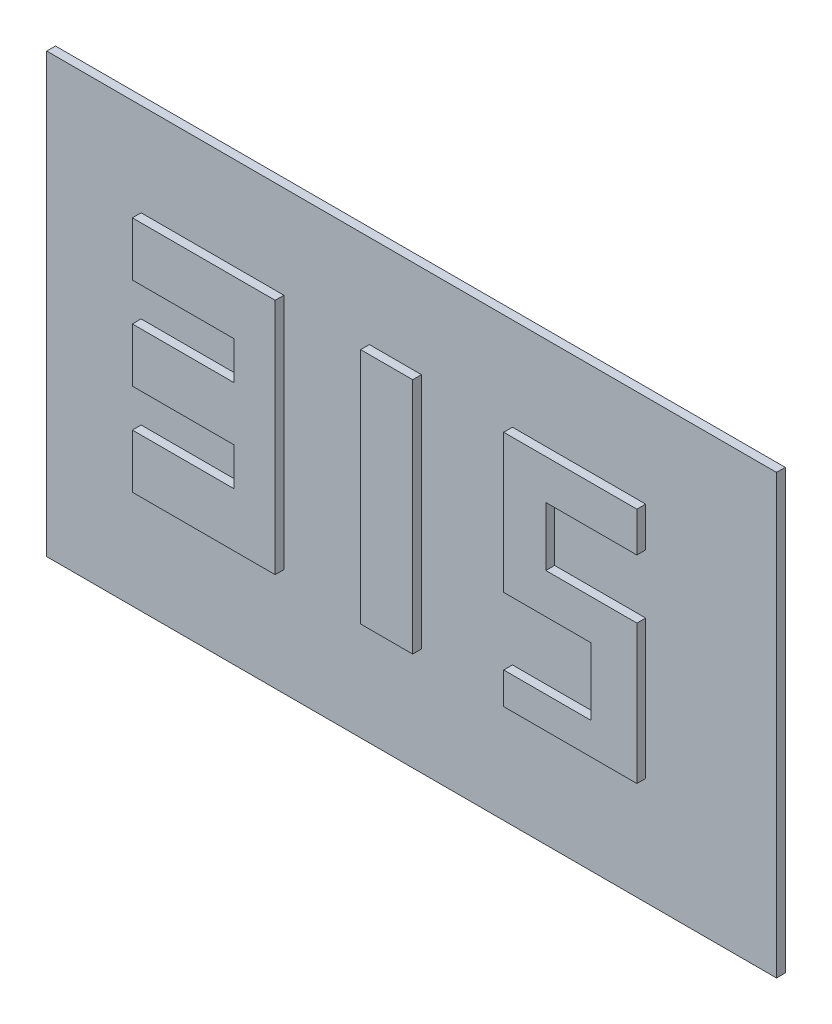
ISO-10303-21;
HEADER;
FILE_DESCRIPTION(('STEP AP214'),'2;1');
FILE_NAME('part.step','',(''),(''),'','','');
FILE_SCHEMA(('AUTOMOTIVE_DESIGN { 1 0 10303 214 1 1 1 1 }'));
ENDSEC;
DATA;
#1=APPLICATION_CONTEXT('core data for automotive mechanical design processes');
#2=APPLICATION_PROTOCOL_DEFINITION('international standard','automotive_design',2000,#1);
#3=PRODUCT_CONTEXT('',#1,'mechanical');
#4=PRODUCT('Part','Part','',(#3));
#5=PRODUCT_RELATED_PRODUCT_CATEGORY('part','',(#4));
#6=PRODUCT_DEFINITION_FORMATION('','',#4);
#7=PRODUCT_DEFINITION_CONTEXT('part definition',#1,'design');
#8=PRODUCT_DEFINITION('design','',#6,#7);
#9=PRODUCT_DEFINITION_SHAPE('','',#8);
#10=(LENGTH_UNIT() NAMED_UNIT(*) SI_UNIT(.MILLI.,.METRE.));
#11=(NAMED_UNIT(*) PLANE_ANGLE_UNIT() SI_UNIT($,.RADIAN.));
#12=(NAMED_UNIT(*) SI_UNIT($,.STERADIAN.) SOLID_ANGLE_UNIT());
#13=UNCERTAINTY_MEASURE_WITH_UNIT(LENGTH_MEASURE(1.E-05),#10,'distance_accuracy_value','');
#14=(GEOMETRIC_REPRESENTATION_CONTEXT(3) GLOBAL_UNCERTAINTY_ASSIGNED_CONTEXT((#13)) GLOBAL_UNIT_ASSIGNED_CONTEXT((#10,
#11,#12)) REPRESENTATION_CONTEXT('',''));
#15=CARTESIAN_POINT('',(0.,0.,0.));
#16=DIRECTION('',(0.,0.,1.));
#17=DIRECTION('',(1.,0.,0.));
#18=AXIS2_PLACEMENT_3D('',#15,#16,#17);
#19=CARTESIAN_POINT('',(-66.3624700861632,-39.7036138012313,3.));
#20=DIRECTION('',(0.,0.,1.));
#21=DIRECTION('',(1.,0.,0.));
#22=AXIS2_PLACEMENT_3D('',#19,#20,#21);
#23=PLANE('',#22);
#24=DIRECTION('',(1.,0.,0.));
#25=VECTOR('',#24,1.);
#26=CARTESIAN_POINT('',(-66.3624700861632,110.306362673787,3.));
#27=LINE('',#26,#25);
#28=CARTESIAN_POINT('',(-66.3624700861632,110.306362673787,3.));
#29=VERTEX_POINT('',#28);
#30=CARTESIAN_POINT('',(183.648168456552,110.306362673787,3.));
#31=VERTEX_POINT('',#30);
#32=EDGE_CURVE('E289',#29,#31,#27,.T.);
#33=ORIENTED_EDGE('',*,*,#32,.F.);
#34=DIRECTION('',(0.,1.,0.));
#35=VECTOR('',#34,1.);
#36=CARTESIAN_POINT('',(-66.3624700861632,-39.7036138012313,3.));
#37=LINE('',#36,#35);
#38=CARTESIAN_POINT('',(-66.3624700861632,-39.7036138012313,3.));
#39=VERTEX_POINT('',#38);
#40=EDGE_CURVE('E271',#39,#29,#37,.T.);
#41=ORIENTED_EDGE('',*,*,#40,.F.);
#42=DIRECTION('',(1.,0.,0.));
#43=VECTOR('',#42,1.);
#44=CARTESIAN_POINT('',(-66.3624700861632,-39.7036138012313,3.));
#45=LINE('',#44,#43);
#46=CARTESIAN_POINT('',(183.648168456552,-39.7036138012313,3.));
#47=VERTEX_POINT('',#46);
#48=EDGE_CURVE('E263',#39,#47,#45,.T.);
#49=ORIENTED_EDGE('',*,*,#48,.T.);
#50=DIRECTION('',(0.,1.,0.));
#51=VECTOR('',#50,1.);
#52=CARTESIAN_POINT('',(183.648168456552,-39.7036138012313,3.));
#53=LINE('',#52,#51);
#54=EDGE_CURVE('E268',#47,#31,#53,.T.);
#55=ORIENTED_EDGE('',*,*,#54,.T.);
#56=EDGE_LOOP('',(#33,#41,#49,#55));
#57=FACE_BOUND('',#56,.T.);
#58=DIRECTION('',(1.,0.,0.));
#59=VECTOR('',#58,1.);
#60=CARTESIAN_POINT('',(93.1901538605668,30.975039233359,3.));
#61=LINE('',#60,#59);
#62=CARTESIAN_POINT('',(93.1901538605668,30.975039233359,3.));
#63=VERTEX_POINT('',#62);
#64=CARTESIAN_POINT('',(123.044447567463,30.975039233359,3.));
#65=VERTEX_POINT('',#64);
#66=EDGE_CURVE('E296',#63,#65,#61,.T.);
#67=ORIENTED_EDGE('',*,*,#66,.F.);
#68=DIRECTION('',(0.,-1.,0.));
#69=VECTOR('',#68,1.);
#70=CARTESIAN_POINT('',(93.1901538605668,30.975039233359,3.));
#71=LINE('',#70,#69);
#72=CARTESIAN_POINT('',(93.1901538605668,78.4878188977571,3.));
#73=VERTEX_POINT('',#72);
#74=EDGE_CURVE('E299',#73,#63,#71,.T.);
#75=ORIENTED_EDGE('',*,*,#74,.F.);
#76=DIRECTION('',(-1.,0.,0.));
#77=VECTOR('',#76,1.);
#78=CARTESIAN_POINT('',(93.1901538605668,78.4878188977571,3.));
#79=LINE('',#78,#77);
#80=CARTESIAN_POINT('',(138.816527261673,78.4878188977571,3.));
#81=VERTEX_POINT('',#80);
#82=EDGE_CURVE('E305',#81,#73,#79,.T.);
#83=ORIENTED_EDGE('',*,*,#82,.F.);
#84=DIRECTION('',(0.,1.,0.));
#85=VECTOR('',#84,1.);
#86=CARTESIAN_POINT('',(138.816527261673,78.4878188977571,3.));
#87=LINE('',#86,#85);
#88=CARTESIAN_POINT('',(138.816527261673,64.8843945298662,3.));
#89=VERTEX_POINT('',#88);
#90=EDGE_CURVE('E308',#89,#81,#87,.T.);
#91=ORIENTED_EDGE('',*,*,#90,.F.);
#92=DIRECTION('',(1.,0.,0.));
#93=VECTOR('',#92,1.);
#94=CARTESIAN_POINT('',(107.631986914306,64.8843945298662,3.));
#95=LINE('',#94,#93);
#96=CARTESIAN_POINT('',(107.631986914306,64.8843945298662,3.));
#97=VERTEX_POINT('',#96);
#98=EDGE_CURVE('E313',#97,#89,#95,.T.);
#99=ORIENTED_EDGE('',*,*,#98,.F.);
#100=DIRECTION('',(0.,1.,0.));
#101=VECTOR('',#100,1.);
#102=CARTESIAN_POINT('',(107.631986914306,64.8843945298662,3.));
#103=LINE('',#102,#101);
#104=CARTESIAN_POINT('',(107.631986914306,44.6883814488582,3.));
#105=VERTEX_POINT('',#104);
#106=EDGE_CURVE('E316',#105,#97,#103,.T.);
#107=ORIENTED_EDGE('',*,*,#106,.F.);
#108=DIRECTION('',(-1.,0.,0.));
#109=VECTOR('',#108,1.);
#110=CARTESIAN_POINT('',(107.631986914306,44.6883814488582,3.));
#111=LINE('',#110,#109);
#112=CARTESIAN_POINT('',(138.816527261673,44.6883814488582,3.));
#113=VERTEX_POINT('',#112);
#114=EDGE_CURVE('E319',#113,#105,#111,.T.);
#115=ORIENTED_EDGE('',*,*,#114,.F.);
#116=DIRECTION('',(0.,1.,0.));
#117=VECTOR('',#116,1.);
#118=CARTESIAN_POINT('',(138.816527261673,44.6883814488582,3.));
#119=LINE('',#118,#117);
#120=CARTESIAN_POINT('',(138.816527261673,-2.91899550319413,3.));
#121=VERTEX_POINT('',#120);
#122=EDGE_CURVE('E322',#121,#113,#119,.T.);
#123=ORIENTED_EDGE('',*,*,#122,.F.);
#124=DIRECTION('',(1.,0.,0.));
#125=VECTOR('',#124,1.);
#126=CARTESIAN_POINT('',(93.1901538605668,-2.91899550319413,3.));
#127=LINE('',#126,#125);
#128=CARTESIAN_POINT('',(93.1901538605668,-2.91899550319413,3.));
#129=VERTEX_POINT('',#128);
#130=EDGE_CURVE('E325',#129,#121,#127,.T.);
#131=ORIENTED_EDGE('',*,*,#130,.F.);
#132=DIRECTION('',(0.,-1.,0.));
#133=VECTOR('',#132,1.);
#134=CARTESIAN_POINT('',(93.1901538605668,-2.91899550319413,3.));
#135=LINE('',#134,#133);
#136=CARTESIAN_POINT('',(93.1901538605668,7.95734499633109,3.));
#137=VERTEX_POINT('',#136);
#138=EDGE_CURVE('E328',#137,#129,#135,.T.);
#139=ORIENTED_EDGE('',*,*,#138,.F.);
#140=DIRECTION('',(-1.,0.,0.));
#141=VECTOR('',#140,1.);
#142=CARTESIAN_POINT('',(123.044447567463,7.95734499633109,3.));
#143=LINE('',#142,#141);
#144=CARTESIAN_POINT('',(123.044447567463,7.95734499633109,3.));
#145=VERTEX_POINT('',#144);
#146=EDGE_CURVE('E331',#145,#137,#143,.T.);
#147=ORIENTED_EDGE('',*,*,#146,.F.);
#148=DIRECTION('',(0.,-1.,0.));
#149=VECTOR('',#148,1.);
#150=CARTESIAN_POINT('',(123.044447567463,30.975039233359,3.));
#151=LINE('',#150,#149);
#152=EDGE_CURVE('E300',#65,#145,#151,.T.);
#153=ORIENTED_EDGE('',*,*,#152,.F.);
#154=EDGE_LOOP('',(#67,#75,#83,#91,#99,#107,#115,#123,#131,#139,#147,#153));
#155=FACE_BOUND('',#154,.T.);
#156=DIRECTION('',(1.,0.,0.));
#157=VECTOR('',#156,1.);
#158=CARTESIAN_POINT('',(44.1696736487118,-2.91899550319413,3.));
#159=LINE('',#158,#157);
#160=CARTESIAN_POINT('',(44.1696736487118,-2.91899550319413,3.));
#161=VERTEX_POINT('',#160);
#162=CARTESIAN_POINT('',(62.0071447314487,-2.91899550319413,3.));
#163=VERTEX_POINT('',#162);
#164=EDGE_CURVE('E336',#161,#163,#159,.T.);
#165=ORIENTED_EDGE('',*,*,#164,.F.);
#166=DIRECTION('',(0.,-1.,0.));
#167=VECTOR('',#166,1.);
#168=CARTESIAN_POINT('',(44.1696736487118,78.4878188977571,3.));
#169=LINE('',#168,#167);
#170=CARTESIAN_POINT('',(44.1696736487118,78.4878188977571,3.));
#171=VERTEX_POINT('',#170);
#172=EDGE_CURVE('E339',#171,#161,#169,.T.);
#173=ORIENTED_EDGE('',*,*,#172,.F.);
#174=DIRECTION('',(-1.,0.,0.));
#175=VECTOR('',#174,1.);
#176=CARTESIAN_POINT('',(44.1696736487118,78.4878188977571,3.));
#177=LINE('',#176,#175);
#178=CARTESIAN_POINT('',(62.0071447314487,78.4878188977571,3.));
#179=VERTEX_POINT('',#178);
#180=EDGE_CURVE('E345',#179,#171,#177,.T.);
#181=ORIENTED_EDGE('',*,*,#180,.F.);
#182=DIRECTION('',(0.,1.,0.));
#183=VECTOR('',#182,1.);
#184=CARTESIAN_POINT('',(62.0071447314487,78.4878188977571,3.));
#185=LINE('',#184,#183);
#186=EDGE_CURVE('E340',#163,#179,#185,.T.);
#187=ORIENTED_EDGE('',*,*,#186,.F.);
#188=EDGE_LOOP('',(#165,#173,#181,#187));
#189=FACE_BOUND('',#188,.T.);
#190=DIRECTION('',(1.,0.,0.));
#191=VECTOR('',#190,1.);
#192=CARTESIAN_POINT('',(-34.0341186940484,60.0379505387289,3.));
#193=LINE('',#192,#191);
#194=CARTESIAN_POINT('',(-34.0341186940484,60.0379505387289,3.));
#195=VERTEX_POINT('',#194);
#196=CARTESIAN_POINT('',(0.744298141440614,60.0379505387289,3.));
#197=VERTEX_POINT('',#196);
#198=EDGE_CURVE('E352',#195,#197,#193,.T.);
#199=ORIENTED_EDGE('',*,*,#198,.F.);
#200=DIRECTION('',(0.,-1.,0.));
#201=VECTOR('',#200,1.);
#202=CARTESIAN_POINT('',(-34.0341186940484,78.4878188977571,3.));
#203=LINE('',#202,#201);
#204=CARTESIAN_POINT('',(-34.0341186940484,78.4878188977571,3.));
#205=VERTEX_POINT('',#204);
#206=EDGE_CURVE('E344',#205,#195,#203,.T.);
#207=ORIENTED_EDGE('',*,*,#206,.F.);
#208=DIRECTION('',(-1.,0.,0.));
#209=VECTOR('',#208,1.);
#210=CARTESIAN_POINT('',(-34.0341186940484,78.4878188977571,3.));
#211=LINE('',#210,#209);
#212=CARTESIAN_POINT('',(14.8859034973977,78.4878188977571,3.));
#213=VERTEX_POINT('',#212);
#214=EDGE_CURVE('E359',#213,#205,#211,.T.);
#215=ORIENTED_EDGE('',*,*,#214,.F.);
#216=DIRECTION('',(0.,1.,0.));
#217=VECTOR('',#216,1.);
#218=CARTESIAN_POINT('',(14.8859034973977,78.4878188977571,3.));
#219=LINE('',#218,#217);
#220=CARTESIAN_POINT('',(14.8859034973977,-2.91899550319413,3.));
#221=VERTEX_POINT('',#220);
#222=EDGE_CURVE('E363',#221,#213,#219,.T.);
#223=ORIENTED_EDGE('',*,*,#222,.F.);
#224=DIRECTION('',(1.,0.,0.));
#225=VECTOR('',#224,1.);
#226=CARTESIAN_POINT('',(-34.0341186940484,-2.91899550319413,3.));
#227=LINE('',#226,#225);
#228=CARTESIAN_POINT('',(-34.0341186940484,-2.91899550319413,3.));
#229=VERTEX_POINT('',#228);
#230=EDGE_CURVE('E366',#229,#221,#227,.T.);
#231=ORIENTED_EDGE('',*,*,#230,.F.);
#232=DIRECTION('',(0.,-1.,0.));
#233=VECTOR('',#232,1.);
#234=CARTESIAN_POINT('',(-34.0341186940484,-2.91899550319413,3.));
#235=LINE('',#234,#233);
#236=CARTESIAN_POINT('',(-34.0341186940484,15.530872855834,3.));
#237=VERTEX_POINT('',#236);
#238=EDGE_CURVE('E369',#237,#229,#235,.T.);
#239=ORIENTED_EDGE('',*,*,#238,.F.);
#240=DIRECTION('',(-1.,0.,0.));
#241=VECTOR('',#240,1.);
#242=CARTESIAN_POINT('',(0.744298141440627,15.5308728558341,3.));
#243=LINE('',#242,#241);
#244=CARTESIAN_POINT('',(0.744298141440627,15.5308728558341,3.));
#245=VERTEX_POINT('',#244);
#246=EDGE_CURVE('E372',#245,#237,#243,.T.);
#247=ORIENTED_EDGE('',*,*,#246,.F.);
#248=DIRECTION('',(0.,-1.,0.));
#249=VECTOR('',#248,1.);
#250=CARTESIAN_POINT('',(0.744298141440627,28.5594775177674,3.));
#251=LINE('',#250,#249);
#252=CARTESIAN_POINT('',(0.744298141440627,28.5594775177674,3.));
#253=VERTEX_POINT('',#252);
#254=EDGE_CURVE('E375',#253,#245,#251,.T.);
#255=ORIENTED_EDGE('',*,*,#254,.F.);
#256=DIRECTION('',(1.,0.,0.));
#257=VECTOR('',#256,1.);
#258=CARTESIAN_POINT('',(0.744298141440627,28.5594775177674,3.));
#259=LINE('',#258,#257);
#260=CARTESIAN_POINT('',(-34.0341186940484,28.5594775177674,3.));
#261=VERTEX_POINT('',#260);
#262=EDGE_CURVE('E378',#261,#253,#259,.T.);
#263=ORIENTED_EDGE('',*,*,#262,.F.);
#264=DIRECTION('',(0.,-1.,0.));
#265=VECTOR('',#264,1.);
#266=CARTESIAN_POINT('',(-34.0341186940484,47.0093458767955,3.));
#267=LINE('',#266,#265);
#268=CARTESIAN_POINT('',(-34.0341186940484,47.0093458767955,3.));
#269=VERTEX_POINT('',#268);
#270=EDGE_CURVE('E381',#269,#261,#267,.T.);
#271=ORIENTED_EDGE('',*,*,#270,.F.);
#272=DIRECTION('',(-1.,0.,0.));
#273=VECTOR('',#272,1.);
#274=CARTESIAN_POINT('',(0.744298141440614,47.0093458767956,3.));
#275=LINE('',#274,#273);
#276=CARTESIAN_POINT('',(0.744298141440614,47.0093458767956,3.));
#277=VERTEX_POINT('',#276);
#278=EDGE_CURVE('E384',#277,#269,#275,.T.);
#279=ORIENTED_EDGE('',*,*,#278,.F.);
#280=DIRECTION('',(0.,-1.,0.));
#281=VECTOR('',#280,1.);
#282=CARTESIAN_POINT('',(0.744298141440614,60.0379505387289,3.));
#283=LINE('',#282,#281);
#284=EDGE_CURVE('E355',#197,#277,#283,.T.);
#285=ORIENTED_EDGE('',*,*,#284,.F.);
#286=EDGE_LOOP('',(#199,#207,#215,#223,#231,#239,#247,#255,#263,#271,#279,#285));
#287=FACE_BOUND('',#286,.T.);
#288=ADVANCED_FACE('F46',(#57,#155,#189,#287),#23,.T.);
#289=CARTESIAN_POINT('',(-66.3624700861632,110.306362673787,3.));
#290=DIRECTION('',(0.,1.,0.));
#291=DIRECTION('',(0.,0.,1.));
#292=AXIS2_PLACEMENT_3D('',#289,#290,#291);
#293=PLANE('',#292);
#294=DIRECTION('',(1.,0.,0.));
#295=VECTOR('',#294,1.);
#296=CARTESIAN_POINT('',(-66.3624700861632,110.306362673787,0.));
#297=LINE('',#296,#295);
#298=CARTESIAN_POINT('',(-66.3624700861632,110.306362673787,0.));
#299=VERTEX_POINT('',#298);
#300=CARTESIAN_POINT('',(183.648168456552,110.306362673787,0.));
#301=VERTEX_POINT('',#300);
#302=EDGE_CURVE('E389',#299,#301,#297,.T.);
#303=ORIENTED_EDGE('',*,*,#302,.F.);
#304=DIRECTION('',(0.,0.,-1.));
#305=VECTOR('',#304,1.);
#306=CARTESIAN_POINT('',(-66.3624700861632,110.306362673787,3.));
#307=LINE('',#306,#305);
#308=EDGE_CURVE('E12',#29,#299,#307,.T.);
#309=ORIENTED_EDGE('',*,*,#308,.F.);
#310=ORIENTED_EDGE('',*,*,#32,.T.);
#311=DIRECTION('',(0.,0.,-1.));
#312=VECTOR('',#311,1.);
#313=CARTESIAN_POINT('',(183.648168456552,110.306362673787,3.));
#314=LINE('',#313,#312);
#315=EDGE_CURVE('E284',#31,#301,#314,.T.);
#316=ORIENTED_EDGE('',*,*,#315,.T.);
#317=EDGE_LOOP('',(#303,#309,#310,#316));
#318=FACE_BOUND('',#317,.T.);
#319=ADVANCED_FACE('F639',(#318),#293,.T.);
#320=CARTESIAN_POINT('',(-66.3624700861632,-39.7036138012313,3.));
#321=DIRECTION('',(-1.,0.,0.));
#322=DIRECTION('',(0.,0.,1.));
#323=AXIS2_PLACEMENT_3D('',#320,#321,#322);
#324=PLANE('',#323);
#325=DIRECTION('',(0.,1.,0.));
#326=VECTOR('',#325,1.);
#327=CARTESIAN_POINT('',(-66.3624700861632,-39.7036138012313,0.));
#328=LINE('',#327,#326);
#329=CARTESIAN_POINT('',(-66.3624700861632,-39.7036138012313,0.));
#330=VERTEX_POINT('',#329);
#331=EDGE_CURVE('E292',#330,#299,#328,.T.);
#332=ORIENTED_EDGE('',*,*,#331,.F.);
#333=DIRECTION('',(0.,0.,-1.));
#334=VECTOR('',#333,1.);
#335=CARTESIAN_POINT('',(-66.3624700861632,-39.7036138012313,3.));
#336=LINE('',#335,#334);
#337=EDGE_CURVE('E57',#39,#330,#336,.T.);
#338=ORIENTED_EDGE('',*,*,#337,.F.);
#339=ORIENTED_EDGE('',*,*,#40,.T.);
#340=ORIENTED_EDGE('',*,*,#308,.T.);
#341=EDGE_LOOP('',(#332,#338,#339,#340));
#342=FACE_BOUND('',#341,.T.);
#343=ADVANCED_FACE('F644',(#342),#324,.T.);
#344=CARTESIAN_POINT('',(-66.3624700861632,-39.7036138012313,3.));
#345=DIRECTION('',(0.,1.,0.));
#346=DIRECTION('',(0.,0.,1.));
#347=AXIS2_PLACEMENT_3D('',#344,#345,#346);
#348=PLANE('',#347);
#349=DIRECTION('',(1.,0.,0.));
#350=VECTOR('',#349,1.);
#351=CARTESIAN_POINT('',(-66.3624700861632,-39.7036138012313,0.));
#352=LINE('',#351,#350);
#353=CARTESIAN_POINT('',(183.648168456552,-39.7036138012313,0.));
#354=VERTEX_POINT('',#353);
#355=EDGE_CURVE('E279',#330,#354,#352,.T.);
#356=ORIENTED_EDGE('',*,*,#355,.T.);
#357=DIRECTION('',(0.,0.,-1.));
#358=VECTOR('',#357,1.);
#359=CARTESIAN_POINT('',(183.648168456552,-39.7036138012313,3.));
#360=LINE('',#359,#358);
#361=EDGE_CURVE('E276',#47,#354,#360,.T.);
#362=ORIENTED_EDGE('',*,*,#361,.F.);
#363=ORIENTED_EDGE('',*,*,#48,.F.);
#364=ORIENTED_EDGE('',*,*,#337,.T.);
#365=EDGE_LOOP('',(#356,#362,#363,#364));
#366=FACE_BOUND('',#365,.T.);
#367=ADVANCED_FACE('F277',(#366),#348,.F.);
#368=CARTESIAN_POINT('',(183.648168456552,-39.7036138012313,3.));
#369=DIRECTION('',(-1.,0.,0.));
#370=DIRECTION('',(0.,0.,1.));
#371=AXIS2_PLACEMENT_3D('',#368,#369,#370);
#372=PLANE('',#371);
#373=DIRECTION('',(0.,1.,0.));
#374=VECTOR('',#373,1.);
#375=CARTESIAN_POINT('',(183.648168456552,-39.7036138012313,0.));
#376=LINE('',#375,#374);
#377=EDGE_CURVE('E392',#354,#301,#376,.T.);
#378=ORIENTED_EDGE('',*,*,#377,.T.);
#379=ORIENTED_EDGE('',*,*,#315,.F.);
#380=ORIENTED_EDGE('',*,*,#54,.F.);
#381=ORIENTED_EDGE('',*,*,#361,.T.);
#382=EDGE_LOOP('',(#378,#379,#380,#381));
#383=FACE_BOUND('',#382,.T.);
#384=ADVANCED_FACE('F286',(#383),#372,.F.);
#385=CARTESIAN_POINT('',(-66.3624700861632,-39.7036138012313,0.));
#386=DIRECTION('',(0.,0.,1.));
#387=DIRECTION('',(1.,0.,0.));
#388=AXIS2_PLACEMENT_3D('',#385,#386,#387);
#389=PLANE('',#388);
#390=ORIENTED_EDGE('',*,*,#302,.T.);
#391=ORIENTED_EDGE('',*,*,#377,.F.);
#392=ORIENTED_EDGE('',*,*,#355,.F.);
#393=ORIENTED_EDGE('',*,*,#331,.T.);
#394=EDGE_LOOP('',(#390,#391,#392,#393));
#395=FACE_BOUND('',#394,.T.);
#396=ADVANCED_FACE('F655',(#395),#389,.F.);
#397=CARTESIAN_POINT('',(93.1901538605668,30.975039233359,6.));
#398=DIRECTION('',(1.,0.,0.));
#399=DIRECTION('',(0.,0.,-1.));
#400=AXIS2_PLACEMENT_3D('',#397,#398,#399);
#401=PLANE('',#400);
#402=ORIENTED_EDGE('',*,*,#74,.T.);
#403=DIRECTION('',(0.,0.,-1.));
#404=VECTOR('',#403,1.);
#405=CARTESIAN_POINT('',(93.1901538605668,30.975039233359,6.));
#406=LINE('',#405,#404);
#407=CARTESIAN_POINT('',(93.1901538605668,30.975039233359,6.));
#408=VERTEX_POINT('',#407);
#409=EDGE_CURVE('E406',#408,#63,#406,.T.);
#410=ORIENTED_EDGE('',*,*,#409,.F.);
#411=DIRECTION('',(0.,-1.,0.));
#412=VECTOR('',#411,1.);
#413=CARTESIAN_POINT('',(93.1901538605668,30.975039233359,6.));
#414=LINE('',#413,#412);
#415=CARTESIAN_POINT('',(93.1901538605668,78.4878188977571,6.));
#416=VERTEX_POINT('',#415);
#417=EDGE_CURVE('E309',#416,#408,#414,.T.);
#418=ORIENTED_EDGE('',*,*,#417,.F.);
#419=DIRECTION('',(0.,0.,-1.));
#420=VECTOR('',#419,1.);
#421=CARTESIAN_POINT('',(93.1901538605668,78.4878188977571,6.));
#422=LINE('',#421,#420);
#423=EDGE_CURVE('E414',#416,#73,#422,.T.);
#424=ORIENTED_EDGE('',*,*,#423,.T.);
#425=EDGE_LOOP('',(#402,#410,#418,#424));
#426=FACE_BOUND('',#425,.T.);
#427=ADVANCED_FACE('F658',(#426),#401,.F.);
#428=CARTESIAN_POINT('',(93.1901538605668,30.975039233359,6.));
#429=DIRECTION('',(0.,1.,0.));
#430=DIRECTION('',(0.,0.,1.));
#431=AXIS2_PLACEMENT_3D('',#428,#429,#430);
#432=PLANE('',#431);
#433=ORIENTED_EDGE('',*,*,#66,.T.);
#434=DIRECTION('',(0.,0.,-1.));
#435=VECTOR('',#434,1.);
#436=CARTESIAN_POINT('',(123.044447567463,30.975039233359,6.));
#437=LINE('',#436,#435);
#438=CARTESIAN_POINT('',(123.044447567463,30.975039233359,6.));
#439=VERTEX_POINT('',#438);
#440=EDGE_CURVE('E409',#439,#65,#437,.T.);
#441=ORIENTED_EDGE('',*,*,#440,.F.);
#442=DIRECTION('',(1.,0.,0.));
#443=VECTOR('',#442,1.);
#444=CARTESIAN_POINT('',(93.1901538605668,30.975039233359,6.));
#445=LINE('',#444,#443);
#446=EDGE_CURVE('E413',#408,#439,#445,.T.);
#447=ORIENTED_EDGE('',*,*,#446,.F.);
#448=ORIENTED_EDGE('',*,*,#409,.T.);
#449=EDGE_LOOP('',(#433,#441,#447,#448));
#450=FACE_BOUND('',#449,.T.);
#451=ADVANCED_FACE('F662',(#450),#432,.F.);
#452=CARTESIAN_POINT('',(123.044447567463,30.975039233359,6.));
#453=DIRECTION('',(1.,0.,0.));
#454=DIRECTION('',(0.,0.,-1.));
#455=AXIS2_PLACEMENT_3D('',#452,#453,#454);
#456=PLANE('',#455);
#457=ORIENTED_EDGE('',*,*,#152,.T.);
#458=DIRECTION('',(0.,0.,-1.));
#459=VECTOR('',#458,1.);
#460=CARTESIAN_POINT('',(123.044447567463,7.95734499633109,6.));
#461=LINE('',#460,#459);
#462=CARTESIAN_POINT('',(123.044447567463,7.95734499633109,6.));
#463=VERTEX_POINT('',#462);
#464=EDGE_CURVE('E423',#463,#145,#461,.T.);
#465=ORIENTED_EDGE('',*,*,#464,.F.);
#466=DIRECTION('',(0.,-1.,0.));
#467=VECTOR('',#466,1.);
#468=CARTESIAN_POINT('',(123.044447567463,30.975039233359,6.));
#469=LINE('',#468,#467);
#470=EDGE_CURVE('E426',#439,#463,#469,.T.);
#471=ORIENTED_EDGE('',*,*,#470,.F.);
#472=ORIENTED_EDGE('',*,*,#440,.T.);
#473=EDGE_LOOP('',(#457,#465,#471,#472));
#474=FACE_BOUND('',#473,.T.);
#475=ADVANCED_FACE('F666',(#474),#456,.F.);
#476=CARTESIAN_POINT('',(123.044447567463,7.95734499633109,6.));
#477=DIRECTION('',(0.,-1.,0.));
#478=DIRECTION('',(1.,0.,0.));
#479=AXIS2_PLACEMENT_3D('',#476,#477,#478);
#480=PLANE('',#479);
#481=ORIENTED_EDGE('',*,*,#146,.T.);
#482=DIRECTION('',(0.,0.,-1.));
#483=VECTOR('',#482,1.);
#484=CARTESIAN_POINT('',(93.1901538605668,7.95734499633109,6.));
#485=LINE('',#484,#483);
#486=CARTESIAN_POINT('',(93.1901538605668,7.95734499633109,6.));
#487=VERTEX_POINT('',#486);
#488=EDGE_CURVE('E430',#487,#137,#485,.T.);
#489=ORIENTED_EDGE('',*,*,#488,.F.);
#490=DIRECTION('',(-1.,0.,0.));
#491=VECTOR('',#490,1.);
#492=CARTESIAN_POINT('',(123.044447567463,7.95734499633109,6.));
#493=LINE('',#492,#491);
#494=EDGE_CURVE('E433',#463,#487,#493,.T.);
#495=ORIENTED_EDGE('',*,*,#494,.F.);
#496=ORIENTED_EDGE('',*,*,#464,.T.);
#497=EDGE_LOOP('',(#481,#489,#495,#496));
#498=FACE_BOUND('',#497,.T.);
#499=ADVANCED_FACE('F670',(#498),#480,.F.);
#500=CARTESIAN_POINT('',(93.1901538605668,-2.91899550319413,6.));
#501=DIRECTION('',(1.,0.,0.));
#502=DIRECTION('',(0.,0.,-1.));
#503=AXIS2_PLACEMENT_3D('',#500,#501,#502);
#504=PLANE('',#503);
#505=ORIENTED_EDGE('',*,*,#138,.T.);
#506=DIRECTION('',(0.,0.,-1.));
#507=VECTOR('',#506,1.);
#508=CARTESIAN_POINT('',(93.1901538605668,-2.91899550319413,6.));
#509=LINE('',#508,#507);
#510=CARTESIAN_POINT('',(93.1901538605668,-2.91899550319413,6.));
#511=VERTEX_POINT('',#510);
#512=EDGE_CURVE('E437',#511,#129,#509,.T.);
#513=ORIENTED_EDGE('',*,*,#512,.F.);
#514=DIRECTION('',(0.,-1.,0.));
#515=VECTOR('',#514,1.);
#516=CARTESIAN_POINT('',(93.1901538605668,-2.91899550319413,6.));
#517=LINE('',#516,#515);
#518=EDGE_CURVE('E440',#487,#511,#517,.T.);
#519=ORIENTED_EDGE('',*,*,#518,.F.);
#520=ORIENTED_EDGE('',*,*,#488,.T.);
#521=EDGE_LOOP('',(#505,#513,#519,#520));
#522=FACE_BOUND('',#521,.T.);
#523=ADVANCED_FACE('F674',(#522),#504,.F.);
#524=CARTESIAN_POINT('',(93.1901538605668,-2.91899550319413,6.));
#525=DIRECTION('',(0.,1.,0.));
#526=DIRECTION('',(0.,0.,1.));
#527=AXIS2_PLACEMENT_3D('',#524,#525,#526);
#528=PLANE('',#527);
#529=ORIENTED_EDGE('',*,*,#130,.T.);
#530=DIRECTION('',(0.,0.,-1.));
#531=VECTOR('',#530,1.);
#532=CARTESIAN_POINT('',(138.816527261673,-2.91899550319413,6.));
#533=LINE('',#532,#531);
#534=CARTESIAN_POINT('',(138.816527261673,-2.91899550319413,6.));
#535=VERTEX_POINT('',#534);
#536=EDGE_CURVE('E444',#535,#121,#533,.T.);
#537=ORIENTED_EDGE('',*,*,#536,.F.);
#538=DIRECTION('',(1.,0.,0.));
#539=VECTOR('',#538,1.);
#540=CARTESIAN_POINT('',(93.1901538605668,-2.91899550319413,6.));
#541=LINE('',#540,#539);
#542=EDGE_CURVE('E447',#511,#535,#541,.T.);
#543=ORIENTED_EDGE('',*,*,#542,.F.);
#544=ORIENTED_EDGE('',*,*,#512,.T.);
#545=EDGE_LOOP('',(#529,#537,#543,#544));
#546=FACE_BOUND('',#545,.T.);
#547=ADVANCED_FACE('F678',(#546),#528,.F.);
#548=CARTESIAN_POINT('',(138.816527261673,44.6883814488582,6.));
#549=DIRECTION('',(-1.,0.,0.));
#550=DIRECTION('',(0.,0.,1.));
#551=AXIS2_PLACEMENT_3D('',#548,#549,#550);
#552=PLANE('',#551);
#553=ORIENTED_EDGE('',*,*,#122,.T.);
#554=DIRECTION('',(0.,0.,-1.));
#555=VECTOR('',#554,1.);
#556=CARTESIAN_POINT('',(138.816527261673,44.6883814488582,6.));
#557=LINE('',#556,#555);
#558=CARTESIAN_POINT('',(138.816527261673,44.6883814488582,6.));
#559=VERTEX_POINT('',#558);
#560=EDGE_CURVE('E451',#559,#113,#557,.T.);
#561=ORIENTED_EDGE('',*,*,#560,.F.);
#562=DIRECTION('',(0.,1.,0.));
#563=VECTOR('',#562,1.);
#564=CARTESIAN_POINT('',(138.816527261673,44.6883814488582,6.));
#565=LINE('',#564,#563);
#566=EDGE_CURVE('E454',#535,#559,#565,.T.);
#567=ORIENTED_EDGE('',*,*,#566,.F.);
#568=ORIENTED_EDGE('',*,*,#536,.T.);
#569=EDGE_LOOP('',(#553,#561,#567,#568));
#570=FACE_BOUND('',#569,.T.);
#571=ADVANCED_FACE('F682',(#570),#552,.F.);
#572=CARTESIAN_POINT('',(107.631986914306,44.6883814488582,6.));
#573=DIRECTION('',(0.,-1.,0.));
#574=DIRECTION('',(0.,0.,-1.));
#575=AXIS2_PLACEMENT_3D('',#572,#573,#574);
#576=PLANE('',#575);
#577=ORIENTED_EDGE('',*,*,#114,.T.);
#578=DIRECTION('',(0.,0.,-1.));
#579=VECTOR('',#578,1.);
#580=CARTESIAN_POINT('',(107.631986914306,44.6883814488582,6.));
#581=LINE('',#580,#579);
#582=CARTESIAN_POINT('',(107.631986914306,44.6883814488582,6.));
#583=VERTEX_POINT('',#582);
#584=EDGE_CURVE('E458',#583,#105,#581,.T.);
#585=ORIENTED_EDGE('',*,*,#584,.F.);
#586=DIRECTION('',(-1.,0.,0.));
#587=VECTOR('',#586,1.);
#588=CARTESIAN_POINT('',(107.631986914306,44.6883814488582,6.));
#589=LINE('',#588,#587);
#590=EDGE_CURVE('E461',#559,#583,#589,.T.);
#591=ORIENTED_EDGE('',*,*,#590,.F.);
#592=ORIENTED_EDGE('',*,*,#560,.T.);
#593=EDGE_LOOP('',(#577,#585,#591,#592));
#594=FACE_BOUND('',#593,.T.);
#595=ADVANCED_FACE('F686',(#594),#576,.F.);
#596=CARTESIAN_POINT('',(107.631986914306,64.8843945298662,6.));
#597=DIRECTION('',(-1.,0.,0.));
#598=DIRECTION('',(0.,0.,1.));
#599=AXIS2_PLACEMENT_3D('',#596,#597,#598);
#600=PLANE('',#599);
#601=ORIENTED_EDGE('',*,*,#106,.T.);
#602=DIRECTION('',(0.,0.,-1.));
#603=VECTOR('',#602,1.);
#604=CARTESIAN_POINT('',(107.631986914306,64.8843945298662,6.));
#605=LINE('',#604,#603);
#606=CARTESIAN_POINT('',(107.631986914306,64.8843945298662,6.));
#607=VERTEX_POINT('',#606);
#608=EDGE_CURVE('E465',#607,#97,#605,.T.);
#609=ORIENTED_EDGE('',*,*,#608,.F.);
#610=DIRECTION('',(0.,1.,0.));
#611=VECTOR('',#610,1.);
#612=CARTESIAN_POINT('',(107.631986914306,64.8843945298662,6.));
#613=LINE('',#612,#611);
#614=EDGE_CURVE('E468',#583,#607,#613,.T.);
#615=ORIENTED_EDGE('',*,*,#614,.F.);
#616=ORIENTED_EDGE('',*,*,#584,.T.);
#617=EDGE_LOOP('',(#601,#609,#615,#616));
#618=FACE_BOUND('',#617,.T.);
#619=ADVANCED_FACE('F690',(#618),#600,.F.);
#620=CARTESIAN_POINT('',(107.631986914306,64.8843945298662,6.));
#621=DIRECTION('',(0.,1.,0.));
#622=DIRECTION('',(0.,0.,1.));
#623=AXIS2_PLACEMENT_3D('',#620,#621,#622);
#624=PLANE('',#623);
#625=ORIENTED_EDGE('',*,*,#98,.T.);
#626=DIRECTION('',(0.,0.,-1.));
#627=VECTOR('',#626,1.);
#628=CARTESIAN_POINT('',(138.816527261673,64.8843945298662,6.));
#629=LINE('',#628,#627);
#630=CARTESIAN_POINT('',(138.816527261673,64.8843945298662,6.));
#631=VERTEX_POINT('',#630);
#632=EDGE_CURVE('E472',#631,#89,#629,.T.);
#633=ORIENTED_EDGE('',*,*,#632,.F.);
#634=DIRECTION('',(1.,0.,0.));
#635=VECTOR('',#634,1.);
#636=CARTESIAN_POINT('',(107.631986914306,64.8843945298662,6.));
#637=LINE('',#636,#635);
#638=EDGE_CURVE('E475',#607,#631,#637,.T.);
#639=ORIENTED_EDGE('',*,*,#638,.F.);
#640=ORIENTED_EDGE('',*,*,#608,.T.);
#641=EDGE_LOOP('',(#625,#633,#639,#640));
#642=FACE_BOUND('',#641,.T.);
#643=ADVANCED_FACE('F694',(#642),#624,.F.);
#644=CARTESIAN_POINT('',(138.816527261673,78.4878188977571,6.));
#645=DIRECTION('',(-1.,0.,0.));
#646=DIRECTION('',(0.,0.,1.));
#647=AXIS2_PLACEMENT_3D('',#644,#645,#646);
#648=PLANE('',#647);
#649=ORIENTED_EDGE('',*,*,#90,.T.);
#650=DIRECTION('',(0.,0.,-1.));
#651=VECTOR('',#650,1.);
#652=CARTESIAN_POINT('',(138.816527261673,78.4878188977571,6.));
#653=LINE('',#652,#651);
#654=CARTESIAN_POINT('',(138.816527261673,78.4878188977571,6.));
#655=VERTEX_POINT('',#654);
#656=EDGE_CURVE('E419',#655,#81,#653,.T.);
#657=ORIENTED_EDGE('',*,*,#656,.F.);
#658=DIRECTION('',(0.,1.,0.));
#659=VECTOR('',#658,1.);
#660=CARTESIAN_POINT('',(138.816527261673,78.4878188977571,6.));
#661=LINE('',#660,#659);
#662=EDGE_CURVE('E481',#631,#655,#661,.T.);
#663=ORIENTED_EDGE('',*,*,#662,.F.);
#664=ORIENTED_EDGE('',*,*,#632,.T.);
#665=EDGE_LOOP('',(#649,#657,#663,#664));
#666=FACE_BOUND('',#665,.T.);
#667=ADVANCED_FACE('F698',(#666),#648,.F.);
#668=CARTESIAN_POINT('',(93.1901538605668,78.4878188977571,6.));
#669=DIRECTION('',(0.,-1.,0.));
#670=DIRECTION('',(0.,0.,-1.));
#671=AXIS2_PLACEMENT_3D('',#668,#669,#670);
#672=PLANE('',#671);
#673=ORIENTED_EDGE('',*,*,#82,.T.);
#674=ORIENTED_EDGE('',*,*,#423,.F.);
#675=DIRECTION('',(-1.,0.,0.));
#676=VECTOR('',#675,1.);
#677=CARTESIAN_POINT('',(93.1901538605668,78.4878188977571,6.));
#678=LINE('',#677,#676);
#679=EDGE_CURVE('E418',#655,#416,#678,.T.);
#680=ORIENTED_EDGE('',*,*,#679,.F.);
#681=ORIENTED_EDGE('',*,*,#656,.T.);
#682=EDGE_LOOP('',(#673,#674,#680,#681));
#683=FACE_BOUND('',#682,.T.);
#684=ADVANCED_FACE('F702',(#683),#672,.F.);
#685=CARTESIAN_POINT('',(-66.3624700861632,-39.7036138012313,6.));
#686=DIRECTION('',(0.,0.,-1.));
#687=DIRECTION('',(-1.,0.,0.));
#688=AXIS2_PLACEMENT_3D('',#685,#686,#687);
#689=PLANE('',#688);
#690=ORIENTED_EDGE('',*,*,#417,.T.);
#691=ORIENTED_EDGE('',*,*,#446,.T.);
#692=ORIENTED_EDGE('',*,*,#470,.T.);
#693=ORIENTED_EDGE('',*,*,#494,.T.);
#694=ORIENTED_EDGE('',*,*,#518,.T.);
#695=ORIENTED_EDGE('',*,*,#542,.T.);
#696=ORIENTED_EDGE('',*,*,#566,.T.);
#697=ORIENTED_EDGE('',*,*,#590,.T.);
#698=ORIENTED_EDGE('',*,*,#614,.T.);
#699=ORIENTED_EDGE('',*,*,#638,.T.);
#700=ORIENTED_EDGE('',*,*,#662,.T.);
#701=ORIENTED_EDGE('',*,*,#679,.T.);
#702=EDGE_LOOP('',(#690,#691,#692,#693,#694,#695,#696,#697,#698,#699,#700,#701));
#703=FACE_BOUND('',#702,.T.);
#704=ADVANCED_FACE('F706',(#703),#689,.F.);
#705=CARTESIAN_POINT('',(44.1696736487118,78.4878188977571,6.));
#706=DIRECTION('',(1.,0.,0.));
#707=DIRECTION('',(0.,0.,-1.));
#708=AXIS2_PLACEMENT_3D('',#705,#706,#707);
#709=PLANE('',#708);
#710=ORIENTED_EDGE('',*,*,#172,.T.);
#711=DIRECTION('',(0.,0.,-1.));
#712=VECTOR('',#711,1.);
#713=CARTESIAN_POINT('',(44.1696736487118,-2.91899550319413,6.));
#714=LINE('',#713,#712);
#715=CARTESIAN_POINT('',(44.1696736487118,-2.91899550319413,6.));
#716=VERTEX_POINT('',#715);
#717=EDGE_CURVE('E304',#716,#161,#714,.T.);
#718=ORIENTED_EDGE('',*,*,#717,.F.);
#719=DIRECTION('',(0.,-1.,0.));
#720=VECTOR('',#719,1.);
#721=CARTESIAN_POINT('',(44.1696736487118,78.4878188977571,6.));
#722=LINE('',#721,#720);
#723=CARTESIAN_POINT('',(44.1696736487118,78.4878188977571,6.));
#724=VERTEX_POINT('',#723);
#725=EDGE_CURVE('E348',#724,#716,#722,.T.);
#726=ORIENTED_EDGE('',*,*,#725,.F.);
#727=DIRECTION('',(0.,0.,-1.));
#728=VECTOR('',#727,1.);
#729=CARTESIAN_POINT('',(44.1696736487118,78.4878188977571,6.));
#730=LINE('',#729,#728);
#731=EDGE_CURVE('E495',#724,#171,#730,.T.);
#732=ORIENTED_EDGE('',*,*,#731,.T.);
#733=EDGE_LOOP('',(#710,#718,#726,#732));
#734=FACE_BOUND('',#733,.T.);
#735=ADVANCED_FACE('F710',(#734),#709,.F.);
#736=CARTESIAN_POINT('',(44.1696736487118,-2.91899550319413,6.));
#737=DIRECTION('',(0.,1.,0.));
#738=DIRECTION('',(0.,0.,1.));
#739=AXIS2_PLACEMENT_3D('',#736,#737,#738);
#740=PLANE('',#739);
#741=ORIENTED_EDGE('',*,*,#164,.T.);
#742=DIRECTION('',(0.,0.,-1.));
#743=VECTOR('',#742,1.);
#744=CARTESIAN_POINT('',(62.0071447314487,-2.91899550319413,6.));
#745=LINE('',#744,#743);
#746=CARTESIAN_POINT('',(62.0071447314487,-2.91899550319413,6.));
#747=VERTEX_POINT('',#746);
#748=EDGE_CURVE('E490',#747,#163,#745,.T.);
#749=ORIENTED_EDGE('',*,*,#748,.F.);
#750=DIRECTION('',(1.,0.,0.));
#751=VECTOR('',#750,1.);
#752=CARTESIAN_POINT('',(44.1696736487118,-2.91899550319413,6.));
#753=LINE('',#752,#751);
#754=EDGE_CURVE('E494',#716,#747,#753,.T.);
#755=ORIENTED_EDGE('',*,*,#754,.F.);
#756=ORIENTED_EDGE('',*,*,#717,.T.);
#757=EDGE_LOOP('',(#741,#749,#755,#756));
#758=FACE_BOUND('',#757,.T.);
#759=ADVANCED_FACE('F714',(#758),#740,.F.);
#760=CARTESIAN_POINT('',(62.0071447314487,78.4878188977571,6.));
#761=DIRECTION('',(-1.,0.,0.));
#762=DIRECTION('',(0.,0.,1.));
#763=AXIS2_PLACEMENT_3D('',#760,#761,#762);
#764=PLANE('',#763);
#765=ORIENTED_EDGE('',*,*,#186,.T.);
#766=DIRECTION('',(0.,0.,-1.));
#767=VECTOR('',#766,1.);
#768=CARTESIAN_POINT('',(62.0071447314487,78.4878188977571,6.));
#769=LINE('',#768,#767);
#770=CARTESIAN_POINT('',(62.0071447314487,78.4878188977571,6.));
#771=VERTEX_POINT('',#770);
#772=EDGE_CURVE('E500',#771,#179,#769,.T.);
#773=ORIENTED_EDGE('',*,*,#772,.F.);
#774=DIRECTION('',(0.,1.,0.));
#775=VECTOR('',#774,1.);
#776=CARTESIAN_POINT('',(62.0071447314487,78.4878188977571,6.));
#777=LINE('',#776,#775);
#778=EDGE_CURVE('E506',#747,#771,#777,.T.);
#779=ORIENTED_EDGE('',*,*,#778,.F.);
#780=ORIENTED_EDGE('',*,*,#748,.T.);
#781=EDGE_LOOP('',(#765,#773,#779,#780));
#782=FACE_BOUND('',#781,.T.);
#783=ADVANCED_FACE('F718',(#782),#764,.F.);
#784=CARTESIAN_POINT('',(44.1696736487118,78.4878188977571,6.));
#785=DIRECTION('',(0.,-1.,0.));
#786=DIRECTION('',(0.,0.,-1.));
#787=AXIS2_PLACEMENT_3D('',#784,#785,#786);
#788=PLANE('',#787);
#789=ORIENTED_EDGE('',*,*,#180,.T.);
#790=ORIENTED_EDGE('',*,*,#731,.F.);
#791=DIRECTION('',(-1.,0.,0.));
#792=VECTOR('',#791,1.);
#793=CARTESIAN_POINT('',(44.1696736487118,78.4878188977571,6.));
#794=LINE('',#793,#792);
#795=EDGE_CURVE('E499',#771,#724,#794,.T.);
#796=ORIENTED_EDGE('',*,*,#795,.F.);
#797=ORIENTED_EDGE('',*,*,#772,.T.);
#798=EDGE_LOOP('',(#789,#790,#796,#797));
#799=FACE_BOUND('',#798,.T.);
#800=ADVANCED_FACE('F722',(#799),#788,.F.);
#801=CARTESIAN_POINT('',(-66.3624700861632,-39.7036138012313,6.));
#802=DIRECTION('',(0.,0.,1.));
#803=DIRECTION('',(1.,0.,0.));
#804=AXIS2_PLACEMENT_3D('',#801,#802,#803);
#805=PLANE('',#804);
#806=ORIENTED_EDGE('',*,*,#725,.T.);
#807=ORIENTED_EDGE('',*,*,#754,.T.);
#808=ORIENTED_EDGE('',*,*,#778,.T.);
#809=ORIENTED_EDGE('',*,*,#795,.T.);
#810=EDGE_LOOP('',(#806,#807,#808,#809));
#811=FACE_BOUND('',#810,.T.);
#812=ADVANCED_FACE('F726',(#811),#805,.T.);
#813=CARTESIAN_POINT('',(-34.0341186940484,78.4878188977571,6.));
#814=DIRECTION('',(1.,0.,0.));
#815=DIRECTION('',(0.,1.,0.));
#816=AXIS2_PLACEMENT_3D('',#813,#814,#815);
#817=PLANE('',#816);
#818=ORIENTED_EDGE('',*,*,#206,.T.);
#819=DIRECTION('',(0.,0.,-1.));
#820=VECTOR('',#819,1.);
#821=CARTESIAN_POINT('',(-34.0341186940484,60.0379505387289,6.));
#822=LINE('',#821,#820);
#823=CARTESIAN_POINT('',(-34.0341186940484,60.0379505387289,6.));
#824=VERTEX_POINT('',#823);
#825=EDGE_CURVE('E393',#824,#195,#822,.T.);
#826=ORIENTED_EDGE('',*,*,#825,.F.);
#827=DIRECTION('',(0.,-1.,0.));
#828=VECTOR('',#827,1.);
#829=CARTESIAN_POINT('',(-34.0341186940484,78.4878188977571,6.));
#830=LINE('',#829,#828);
#831=CARTESIAN_POINT('',(-34.0341186940484,78.4878188977571,6.));
#832=VERTEX_POINT('',#831);
#833=EDGE_CURVE('E362',#832,#824,#830,.T.);
#834=ORIENTED_EDGE('',*,*,#833,.F.);
#835=DIRECTION('',(0.,0.,-1.));
#836=VECTOR('',#835,1.);
#837=CARTESIAN_POINT('',(-34.0341186940484,78.4878188977571,6.));
#838=LINE('',#837,#836);
#839=EDGE_CURVE('E520',#832,#205,#838,.T.);
#840=ORIENTED_EDGE('',*,*,#839,.T.);
#841=EDGE_LOOP('',(#818,#826,#834,#840));
#842=FACE_BOUND('',#841,.T.);
#843=ADVANCED_FACE('F593',(#842),#817,.F.);
#844=CARTESIAN_POINT('',(-34.0341186940484,60.0379505387289,6.));
#845=DIRECTION('',(0.,1.,0.));
#846=DIRECTION('',(0.,0.,1.));
#847=AXIS2_PLACEMENT_3D('',#844,#845,#846);
#848=PLANE('',#847);
#849=ORIENTED_EDGE('',*,*,#198,.T.);
#850=DIRECTION('',(0.,0.,-1.));
#851=VECTOR('',#850,1.);
#852=CARTESIAN_POINT('',(0.744298141440614,60.0379505387289,6.));
#853=LINE('',#852,#851);
#854=CARTESIAN_POINT('',(0.744298141440614,60.0379505387289,6.));
#855=VERTEX_POINT('',#854);
#856=EDGE_CURVE('E515',#855,#197,#853,.T.);
#857=ORIENTED_EDGE('',*,*,#856,.F.);
#858=DIRECTION('',(1.,0.,0.));
#859=VECTOR('',#858,1.);
#860=CARTESIAN_POINT('',(-34.0341186940484,60.0379505387289,6.));
#861=LINE('',#860,#859);
#862=EDGE_CURVE('E519',#824,#855,#861,.T.);
#863=ORIENTED_EDGE('',*,*,#862,.F.);
#864=ORIENTED_EDGE('',*,*,#825,.T.);
#865=EDGE_LOOP('',(#849,#857,#863,#864));
#866=FACE_BOUND('',#865,.T.);
#867=ADVANCED_FACE('F596',(#866),#848,.F.);
#868=CARTESIAN_POINT('',(0.744298141440614,60.0379505387289,6.));
#869=DIRECTION('',(1.,0.,0.));
#870=DIRECTION('',(0.,0.,-1.));
#871=AXIS2_PLACEMENT_3D('',#868,#869,#870);
#872=PLANE('',#871);
#873=ORIENTED_EDGE('',*,*,#284,.T.);
#874=DIRECTION('',(0.,0.,-1.));
#875=VECTOR('',#874,1.);
#876=CARTESIAN_POINT('',(0.744298141440614,47.0093458767956,6.));
#877=LINE('',#876,#875);
#878=CARTESIAN_POINT('',(0.744298141440614,47.0093458767956,6.));
#879=VERTEX_POINT('',#878);
#880=EDGE_CURVE('E527',#879,#277,#877,.T.);
#881=ORIENTED_EDGE('',*,*,#880,.F.);
#882=DIRECTION('',(0.,-1.,0.));
#883=VECTOR('',#882,1.);
#884=CARTESIAN_POINT('',(0.744298141440614,60.0379505387289,6.));
#885=LINE('',#884,#883);
#886=EDGE_CURVE('E530',#855,#879,#885,.T.);
#887=ORIENTED_EDGE('',*,*,#886,.F.);
#888=ORIENTED_EDGE('',*,*,#856,.T.);
#889=EDGE_LOOP('',(#873,#881,#887,#888));
#890=FACE_BOUND('',#889,.T.);
#891=ADVANCED_FACE('F603',(#890),#872,.F.);
#892=CARTESIAN_POINT('',(0.744298141440614,47.0093458767956,6.));
#893=DIRECTION('',(0.,-1.,0.));
#894=DIRECTION('',(1.,0.,0.));
#895=AXIS2_PLACEMENT_3D('',#892,#893,#894);
#896=PLANE('',#895);
#897=ORIENTED_EDGE('',*,*,#278,.T.);
#898=DIRECTION('',(0.,0.,-1.));
#899=VECTOR('',#898,1.);
#900=CARTESIAN_POINT('',(-34.0341186940484,47.0093458767955,6.));
#901=LINE('',#900,#899);
#902=CARTESIAN_POINT('',(-34.0341186940484,47.0093458767955,6.));
#903=VERTEX_POINT('',#902);
#904=EDGE_CURVE('E534',#903,#269,#901,.T.);
#905=ORIENTED_EDGE('',*,*,#904,.F.);
#906=DIRECTION('',(-1.,0.,0.));
#907=VECTOR('',#906,1.);
#908=CARTESIAN_POINT('',(0.744298141440614,47.0093458767956,6.));
#909=LINE('',#908,#907);
#910=EDGE_CURVE('E537',#879,#903,#909,.T.);
#911=ORIENTED_EDGE('',*,*,#910,.F.);
#912=ORIENTED_EDGE('',*,*,#880,.T.);
#913=EDGE_LOOP('',(#897,#905,#911,#912));
#914=FACE_BOUND('',#913,.T.);
#915=ADVANCED_FACE('F607',(#914),#896,.F.);
#916=CARTESIAN_POINT('',(-34.0341186940484,47.0093458767955,6.));
#917=DIRECTION('',(1.,0.,0.));
#918=DIRECTION('',(0.,1.,0.));
#919=AXIS2_PLACEMENT_3D('',#916,#917,#918);
#920=PLANE('',#919);
#921=ORIENTED_EDGE('',*,*,#270,.T.);
#922=DIRECTION('',(0.,0.,-1.));
#923=VECTOR('',#922,1.);
#924=CARTESIAN_POINT('',(-34.0341186940484,28.5594775177674,6.));
#925=LINE('',#924,#923);
#926=CARTESIAN_POINT('',(-34.0341186940484,28.5594775177674,6.));
#927=VERTEX_POINT('',#926);
#928=EDGE_CURVE('E541',#927,#261,#925,.T.);
#929=ORIENTED_EDGE('',*,*,#928,.F.);
#930=DIRECTION('',(0.,-1.,0.));
#931=VECTOR('',#930,1.);
#932=CARTESIAN_POINT('',(-34.0341186940484,47.0093458767955,6.));
#933=LINE('',#932,#931);
#934=EDGE_CURVE('E544',#903,#927,#933,.T.);
#935=ORIENTED_EDGE('',*,*,#934,.F.);
#936=ORIENTED_EDGE('',*,*,#904,.T.);
#937=EDGE_LOOP('',(#921,#929,#935,#936));
#938=FACE_BOUND('',#937,.T.);
#939=ADVANCED_FACE('F612',(#938),#920,.F.);
#940=CARTESIAN_POINT('',(0.744298141440627,28.5594775177674,6.));
#941=DIRECTION('',(0.,1.,0.));
#942=DIRECTION('',(0.,0.,1.));
#943=AXIS2_PLACEMENT_3D('',#940,#941,#942);
#944=PLANE('',#943);
#945=ORIENTED_EDGE('',*,*,#262,.T.);
#946=DIRECTION('',(0.,0.,-1.));
#947=VECTOR('',#946,1.);
#948=CARTESIAN_POINT('',(0.744298141440627,28.5594775177674,6.));
#949=LINE('',#948,#947);
#950=CARTESIAN_POINT('',(0.744298141440627,28.5594775177674,6.));
#951=VERTEX_POINT('',#950);
#952=EDGE_CURVE('E548',#951,#253,#949,.T.);
#953=ORIENTED_EDGE('',*,*,#952,.F.);
#954=DIRECTION('',(1.,0.,0.));
#955=VECTOR('',#954,1.);
#956=CARTESIAN_POINT('',(0.744298141440627,28.5594775177674,6.));
#957=LINE('',#956,#955);
#958=EDGE_CURVE('E551',#927,#951,#957,.T.);
#959=ORIENTED_EDGE('',*,*,#958,.F.);
#960=ORIENTED_EDGE('',*,*,#928,.T.);
#961=EDGE_LOOP('',(#945,#953,#959,#960));
#962=FACE_BOUND('',#961,.T.);
#963=ADVANCED_FACE('F618',(#962),#944,.F.);
#964=CARTESIAN_POINT('',(0.744298141440627,28.5594775177674,6.));
#965=DIRECTION('',(1.,0.,0.));
#966=DIRECTION('',(0.,0.,-1.));
#967=AXIS2_PLACEMENT_3D('',#964,#965,#966);
#968=PLANE('',#967);
#969=ORIENTED_EDGE('',*,*,#254,.T.);
#970=DIRECTION('',(0.,0.,-1.));
#971=VECTOR('',#970,1.);
#972=CARTESIAN_POINT('',(0.744298141440627,15.5308728558341,6.));
#973=LINE('',#972,#971);
#974=CARTESIAN_POINT('',(0.744298141440627,15.5308728558341,6.));
#975=VERTEX_POINT('',#974);
#976=EDGE_CURVE('E555',#975,#245,#973,.T.);
#977=ORIENTED_EDGE('',*,*,#976,.F.);
#978=DIRECTION('',(0.,-1.,0.));
#979=VECTOR('',#978,1.);
#980=CARTESIAN_POINT('',(0.744298141440627,28.5594775177674,6.));
#981=LINE('',#980,#979);
#982=EDGE_CURVE('E558',#951,#975,#981,.T.);
#983=ORIENTED_EDGE('',*,*,#982,.F.);
#984=ORIENTED_EDGE('',*,*,#952,.T.);
#985=EDGE_LOOP('',(#969,#977,#983,#984));
#986=FACE_BOUND('',#985,.T.);
#987=ADVANCED_FACE('F622',(#986),#968,.F.);
#988=CARTESIAN_POINT('',(0.744298141440627,15.5308728558341,6.));
#989=DIRECTION('',(0.,-1.,0.));
#990=DIRECTION('',(1.,0.,0.));
#991=AXIS2_PLACEMENT_3D('',#988,#989,#990);
#992=PLANE('',#991);
#993=ORIENTED_EDGE('',*,*,#246,.T.);
#994=DIRECTION('',(0.,0.,-1.));
#995=VECTOR('',#994,1.);
#996=CARTESIAN_POINT('',(-34.0341186940484,15.530872855834,6.));
#997=LINE('',#996,#995);
#998=CARTESIAN_POINT('',(-34.0341186940484,15.530872855834,6.));
#999=VERTEX_POINT('',#998);
#1000=EDGE_CURVE('E562',#999,#237,#997,.T.);
#1001=ORIENTED_EDGE('',*,*,#1000,.F.);
#1002=DIRECTION('',(-1.,0.,0.));
#1003=VECTOR('',#1002,1.);
#1004=CARTESIAN_POINT('',(0.744298141440627,15.5308728558341,6.));
#1005=LINE('',#1004,#1003);
#1006=EDGE_CURVE('E565',#975,#999,#1005,.T.);
#1007=ORIENTED_EDGE('',*,*,#1006,.F.);
#1008=ORIENTED_EDGE('',*,*,#976,.T.);
#1009=EDGE_LOOP('',(#993,#1001,#1007,#1008));
#1010=FACE_BOUND('',#1009,.T.);
#1011=ADVANCED_FACE('F627',(#1010),#992,.F.);
#1012=CARTESIAN_POINT('',(-34.0341186940484,-2.91899550319413,6.));
#1013=DIRECTION('',(1.,0.,0.));
#1014=DIRECTION('',(0.,0.,-1.));
#1015=AXIS2_PLACEMENT_3D('',#1012,#1013,#1014);
#1016=PLANE('',#1015);
#1017=ORIENTED_EDGE('',*,*,#238,.T.);
#1018=DIRECTION('',(0.,0.,-1.));
#1019=VECTOR('',#1018,1.);
#1020=CARTESIAN_POINT('',(-34.0341186940484,-2.91899550319413,6.));
#1021=LINE('',#1020,#1019);
#1022=CARTESIAN_POINT('',(-34.0341186940484,-2.91899550319413,6.));
#1023=VERTEX_POINT('',#1022);
#1024=EDGE_CURVE('E569',#1023,#229,#1021,.T.);
#1025=ORIENTED_EDGE('',*,*,#1024,.F.);
#1026=DIRECTION('',(0.,-1.,0.));
#1027=VECTOR('',#1026,1.);
#1028=CARTESIAN_POINT('',(-34.0341186940484,-2.91899550319413,6.));
#1029=LINE('',#1028,#1027);
#1030=EDGE_CURVE('E90',#999,#1023,#1029,.T.);
#1031=ORIENTED_EDGE('',*,*,#1030,.F.);
#1032=ORIENTED_EDGE('',*,*,#1000,.T.);
#1033=EDGE_LOOP('',(#1017,#1025,#1031,#1032));
#1034=FACE_BOUND('',#1033,.T.);
#1035=ADVANCED_FACE('F630',(#1034),#1016,.F.);
#1036=CARTESIAN_POINT('',(-34.0341186940484,-2.91899550319413,6.));
#1037=DIRECTION('',(0.,1.,0.));
#1038=DIRECTION('',(0.,0.,1.));
#1039=AXIS2_PLACEMENT_3D('',#1036,#1037,#1038);
#1040=PLANE('',#1039);
#1041=ORIENTED_EDGE('',*,*,#230,.T.);
#1042=DIRECTION('',(0.,0.,-1.));
#1043=VECTOR('',#1042,1.);
#1044=CARTESIAN_POINT('',(14.8859034973977,-2.91899550319413,6.));
#1045=LINE('',#1044,#1043);
#1046=CARTESIAN_POINT('',(14.8859034973977,-2.91899550319413,6.));
#1047=VERTEX_POINT('',#1046);
#1048=EDGE_CURVE('E575',#1047,#221,#1045,.T.);
#1049=ORIENTED_EDGE('',*,*,#1048,.F.);
#1050=DIRECTION('',(1.,0.,0.));
#1051=VECTOR('',#1050,1.);
#1052=CARTESIAN_POINT('',(-34.0341186940484,-2.91899550319413,6.));
#1053=LINE('',#1052,#1051);
#1054=EDGE_CURVE('E85',#1023,#1047,#1053,.T.);
#1055=ORIENTED_EDGE('',*,*,#1054,.F.);
#1056=ORIENTED_EDGE('',*,*,#1024,.T.);
#1057=EDGE_LOOP('',(#1041,#1049,#1055,#1056));
#1058=FACE_BOUND('',#1057,.T.);
#1059=ADVANCED_FACE('F633',(#1058),#1040,.F.);
#1060=CARTESIAN_POINT('',(14.8859034973977,78.4878188977571,6.));
#1061=DIRECTION('',(-1.,0.,0.));
#1062=DIRECTION('',(0.,0.,1.));
#1063=AXIS2_PLACEMENT_3D('',#1060,#1061,#1062);
#1064=PLANE('',#1063);
#1065=ORIENTED_EDGE('',*,*,#222,.T.);
#1066=DIRECTION('',(0.,0.,-1.));
#1067=VECTOR('',#1066,1.);
#1068=CARTESIAN_POINT('',(14.8859034973977,78.4878188977571,6.));
#1069=LINE('',#1068,#1067);
#1070=CARTESIAN_POINT('',(14.8859034973977,78.4878188977571,6.));
#1071=VERTEX_POINT('',#1070);
#1072=EDGE_CURVE('E66',#1071,#213,#1069,.T.);
#1073=ORIENTED_EDGE('',*,*,#1072,.F.);
#1074=DIRECTION('',(0.,1.,0.));
#1075=VECTOR('',#1074,1.);
#1076=CARTESIAN_POINT('',(14.8859034973977,78.4878188977571,6.));
#1077=LINE('',#1076,#1075);
#1078=EDGE_CURVE('E80',#1047,#1071,#1077,.T.);
#1079=ORIENTED_EDGE('',*,*,#1078,.F.);
#1080=ORIENTED_EDGE('',*,*,#1048,.T.);
#1081=EDGE_LOOP('',(#1065,#1073,#1079,#1080));
#1082=FACE_BOUND('',#1081,.T.);
#1083=ADVANCED_FACE('F636',(#1082),#1064,.F.);
#1084=CARTESIAN_POINT('',(-34.0341186940484,78.4878188977571,6.));
#1085=DIRECTION('',(0.,-1.,0.));
#1086=DIRECTION('',(0.,0.,-1.));
#1087=AXIS2_PLACEMENT_3D('',#1084,#1085,#1086);
#1088=PLANE('',#1087);
#1089=ORIENTED_EDGE('',*,*,#214,.T.);
#1090=ORIENTED_EDGE('',*,*,#839,.F.);
#1091=DIRECTION('',(-1.,0.,0.));
#1092=VECTOR('',#1091,1.);
#1093=CARTESIAN_POINT('',(-34.0341186940484,78.4878188977571,6.));
#1094=LINE('',#1093,#1092);
#1095=EDGE_CURVE('E50',#1071,#832,#1094,.T.);
#1096=ORIENTED_EDGE('',*,*,#1095,.F.);
#1097=ORIENTED_EDGE('',*,*,#1072,.T.);
#1098=EDGE_LOOP('',(#1089,#1090,#1096,#1097));
#1099=FACE_BOUND('',#1098,.T.);
#1100=ADVANCED_FACE('F589',(#1099),#1088,.F.);
#1101=CARTESIAN_POINT('',(-66.3624700861632,-39.7036138012313,6.));
#1102=DIRECTION('',(0.,0.,1.));
#1103=DIRECTION('',(1.,0.,0.));
#1104=AXIS2_PLACEMENT_3D('',#1101,#1102,#1103);
#1105=PLANE('',#1104);
#1106=ORIENTED_EDGE('',*,*,#833,.T.);
#1107=ORIENTED_EDGE('',*,*,#862,.T.);
#1108=ORIENTED_EDGE('',*,*,#886,.T.);
#1109=ORIENTED_EDGE('',*,*,#910,.T.);
#1110=ORIENTED_EDGE('',*,*,#934,.T.);
#1111=ORIENTED_EDGE('',*,*,#958,.T.);
#1112=ORIENTED_EDGE('',*,*,#982,.T.);
#1113=ORIENTED_EDGE('',*,*,#1006,.T.);
#1114=ORIENTED_EDGE('',*,*,#1030,.T.);
#1115=ORIENTED_EDGE('',*,*,#1054,.T.);
#1116=ORIENTED_EDGE('',*,*,#1078,.T.);
#1117=ORIENTED_EDGE('',*,*,#1095,.T.);
#1118=EDGE_LOOP('',(#1106,#1107,#1108,#1109,#1110,#1111,#1112,#1113,#1114,#1115,#1116,#1117));
#1119=FACE_BOUND('',#1118,.T.);
#1120=ADVANCED_FACE('F48',(#1119),#1105,.T.);
#1121=CLOSED_SHELL('',(#288,#319,#343,#367,#384,#396,#427,#451,#475,#499,#523,#547,#571,#595,
#619,#643,#667,#684,#704,#735,#759,#783,#800,#812,#843,#867,#891,#915,#939,#963,#987,#1011,
#1035,#1059,#1083,#1100,#1120));
#1122=MANIFOLD_SOLID_BREP('B2',#1121);
#1123=ADVANCED_BREP_SHAPE_REPRESENTATION('',(#18,#1122),#14);
#1124=SHAPE_DEFINITION_REPRESENTATION(#9,#1123);
ENDSEC;
END-ISO-10303-21;
